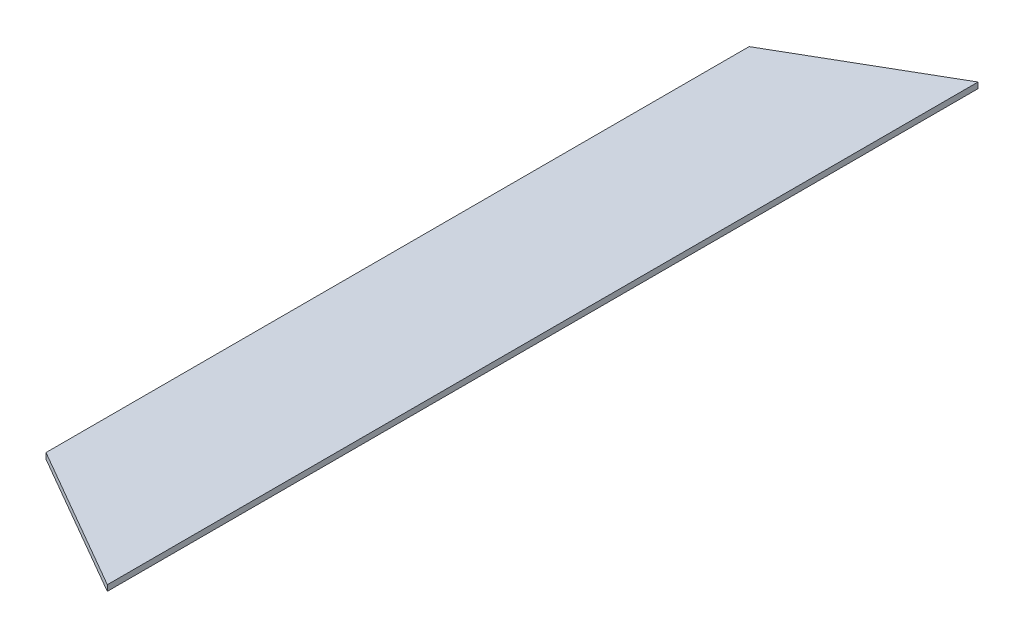
ISO-10303-21;
HEADER;
FILE_DESCRIPTION(('STEP AP214'),'2;1');
FILE_NAME('part.step','',(''),(''),'','','');
FILE_SCHEMA(('AUTOMOTIVE_DESIGN { 1 0 10303 214 1 1 1 1 }'));
ENDSEC;
DATA;
#1=APPLICATION_CONTEXT('core data for automotive mechanical design processes');
#2=APPLICATION_PROTOCOL_DEFINITION('international standard','automotive_design',2000,#1);
#3=PRODUCT_CONTEXT('',#1,'mechanical');
#4=PRODUCT('Part','Part','',(#3));
#5=PRODUCT_RELATED_PRODUCT_CATEGORY('part','',(#4));
#6=PRODUCT_DEFINITION_FORMATION('','',#4);
#7=PRODUCT_DEFINITION_CONTEXT('part definition',#1,'design');
#8=PRODUCT_DEFINITION('design','',#6,#7);
#9=PRODUCT_DEFINITION_SHAPE('','',#8);
#10=(LENGTH_UNIT() NAMED_UNIT(*) SI_UNIT(.MILLI.,.METRE.));
#11=(NAMED_UNIT(*) PLANE_ANGLE_UNIT() SI_UNIT($,.RADIAN.));
#12=(NAMED_UNIT(*) SI_UNIT($,.STERADIAN.) SOLID_ANGLE_UNIT());
#13=UNCERTAINTY_MEASURE_WITH_UNIT(LENGTH_MEASURE(1.E-05),#10,'distance_accuracy_value','');
#14=(GEOMETRIC_REPRESENTATION_CONTEXT(3) GLOBAL_UNCERTAINTY_ASSIGNED_CONTEXT((#13)) GLOBAL_UNIT_ASSIGNED_CONTEXT((#10,
#11,#12)) REPRESENTATION_CONTEXT('',''));
#15=CARTESIAN_POINT('',(0.,0.,0.));
#16=DIRECTION('',(0.,0.,1.));
#17=DIRECTION('',(1.,0.,0.));
#18=AXIS2_PLACEMENT_3D('',#15,#16,#17);
#19=CARTESIAN_POINT('',(-5.,10.,0.));
#20=DIRECTION('',(-1.,0.,0.));
#21=DIRECTION('',(0.,0.,1.));
#22=AXIS2_PLACEMENT_3D('',#19,#20,#21);
#23=PLANE('',#22);
#24=DIRECTION('',(0.,1.,0.));
#25=VECTOR('',#24,1.);
#26=CARTESIAN_POINT('',(-5.,10.,-92.1132486540519));
#27=LINE('',#26,#25);
#28=CARTESIAN_POINT('',(-5.,10.,-92.1132486540519));
#29=VERTEX_POINT('',#28);
#30=CARTESIAN_POINT('',(-5.,10.2,-92.1132486540519));
#31=VERTEX_POINT('',#30);
#32=EDGE_CURVE('E11',#29,#31,#27,.T.);
#33=ORIENTED_EDGE('',*,*,#32,.F.);
#34=DIRECTION('',(0.,0.,1.));
#35=VECTOR('',#34,1.);
#36=CARTESIAN_POINT('',(-5.,10.,0.));
#37=LINE('',#36,#35);
#38=CARTESIAN_POINT('',(-5.,10.,-67.8867513459481));
#39=VERTEX_POINT('',#38);
#40=EDGE_CURVE('E88',#29,#39,#37,.T.);
#41=ORIENTED_EDGE('',*,*,#40,.T.);
#42=DIRECTION('',(0.,1.,0.));
#43=VECTOR('',#42,1.);
#44=CARTESIAN_POINT('',(-5.,10.,-67.8867513459481));
#45=LINE('',#44,#43);
#46=CARTESIAN_POINT('',(-5.,10.2,-67.8867513459481));
#47=VERTEX_POINT('',#46);
#48=EDGE_CURVE('E43',#39,#47,#45,.T.);
#49=ORIENTED_EDGE('',*,*,#48,.T.);
#50=DIRECTION('',(0.,0.,1.));
#51=VECTOR('',#50,1.);
#52=CARTESIAN_POINT('',(-5.,10.2,0.));
#53=LINE('',#52,#51);
#54=EDGE_CURVE('E101',#31,#47,#53,.T.);
#55=ORIENTED_EDGE('',*,*,#54,.F.);
#56=EDGE_LOOP('',(#33,#41,#49,#55));
#57=FACE_BOUND('',#56,.T.);
#58=ADVANCED_FACE('F33',(#57),#23,.T.);
#59=CARTESIAN_POINT('',(-5.,10.,-67.8867513459481));
#60=DIRECTION('',(-0.499999999999997,0.,0.86602540378444));
#61=DIRECTION('',(0.86602540378444,0.,0.499999999999997));
#62=AXIS2_PLACEMENT_3D('',#59,#60,#61);
#63=PLANE('',#62);
#64=ORIENTED_EDGE('',*,*,#48,.F.);
#65=DIRECTION('',(0.86602540378444,0.,0.499999999999997));
#66=VECTOR('',#65,1.);
#67=CARTESIAN_POINT('',(-5.,10.,-67.8867513459481));
#68=LINE('',#67,#66);
#69=CARTESIAN_POINT('',(0.,10.,-65.));
#70=VERTEX_POINT('',#69);
#71=EDGE_CURVE('E95',#39,#70,#68,.T.);
#72=ORIENTED_EDGE('',*,*,#71,.T.);
#73=DIRECTION('',(0.,1.,0.));
#74=VECTOR('',#73,1.);
#75=CARTESIAN_POINT('',(0.,10.,-65.));
#76=LINE('',#75,#74);
#77=CARTESIAN_POINT('',(0.,10.2,-65.));
#78=VERTEX_POINT('',#77);
#79=EDGE_CURVE('E51',#70,#78,#76,.T.);
#80=ORIENTED_EDGE('',*,*,#79,.T.);
#81=DIRECTION('',(0.86602540378444,0.,0.499999999999997));
#82=VECTOR('',#81,1.);
#83=CARTESIAN_POINT('',(-5.,10.2,-67.8867513459481));
#84=LINE('',#83,#82);
#85=EDGE_CURVE('E82',#47,#78,#84,.T.);
#86=ORIENTED_EDGE('',*,*,#85,.F.);
#87=EDGE_LOOP('',(#64,#72,#80,#86));
#88=FACE_BOUND('',#87,.T.);
#89=ADVANCED_FACE('F105',(#88),#63,.T.);
#90=CARTESIAN_POINT('',(0.,10.,0.));
#91=DIRECTION('',(-1.,0.,0.));
#92=DIRECTION('',(0.,0.,1.));
#93=AXIS2_PLACEMENT_3D('',#90,#91,#92);
#94=PLANE('',#93);
#95=ORIENTED_EDGE('',*,*,#79,.F.);
#96=DIRECTION('',(0.,0.,1.));
#97=VECTOR('',#96,1.);
#98=CARTESIAN_POINT('',(0.,10.,0.));
#99=LINE('',#98,#97);
#100=CARTESIAN_POINT('',(0.,10.,-95.));
#101=VERTEX_POINT('',#100);
#102=EDGE_CURVE('E87',#101,#70,#99,.T.);
#103=ORIENTED_EDGE('',*,*,#102,.F.);
#104=DIRECTION('',(0.,1.,0.));
#105=VECTOR('',#104,1.);
#106=CARTESIAN_POINT('',(0.,10.,-95.));
#107=LINE('',#106,#105);
#108=CARTESIAN_POINT('',(0.,10.2,-95.));
#109=VERTEX_POINT('',#108);
#110=EDGE_CURVE('E37',#101,#109,#107,.T.);
#111=ORIENTED_EDGE('',*,*,#110,.T.);
#112=DIRECTION('',(0.,0.,1.));
#113=VECTOR('',#112,1.);
#114=CARTESIAN_POINT('',(0.,10.2,0.));
#115=LINE('',#114,#113);
#116=EDGE_CURVE('E97',#109,#78,#115,.T.);
#117=ORIENTED_EDGE('',*,*,#116,.T.);
#118=EDGE_LOOP('',(#95,#103,#111,#117));
#119=FACE_BOUND('',#118,.T.);
#120=ADVANCED_FACE('F90',(#119),#94,.F.);
#121=CARTESIAN_POINT('',(0.,10.,-95.));
#122=DIRECTION('',(-0.499999999999997,0.,-0.86602540378444));
#123=DIRECTION('',(-0.86602540378444,0.,0.499999999999997));
#124=AXIS2_PLACEMENT_3D('',#121,#122,#123);
#125=PLANE('',#124);
#126=DIRECTION('',(-0.86602540378444,0.,0.499999999999997));
#127=VECTOR('',#126,1.);
#128=CARTESIAN_POINT('',(0.,10.,-95.));
#129=LINE('',#128,#127);
#130=EDGE_CURVE('E76',#101,#29,#129,.T.);
#131=ORIENTED_EDGE('',*,*,#130,.T.);
#132=ORIENTED_EDGE('',*,*,#32,.T.);
#133=DIRECTION('',(-0.86602540378444,0.,0.499999999999997));
#134=VECTOR('',#133,1.);
#135=CARTESIAN_POINT('',(0.,10.2,-95.));
#136=LINE('',#135,#134);
#137=EDGE_CURVE('E78',#109,#31,#136,.T.);
#138=ORIENTED_EDGE('',*,*,#137,.F.);
#139=ORIENTED_EDGE('',*,*,#110,.F.);
#140=EDGE_LOOP('',(#131,#132,#138,#139));
#141=FACE_BOUND('',#140,.T.);
#142=ADVANCED_FACE('F35',(#141),#125,.T.);
#143=CARTESIAN_POINT('',(0.,10.2,0.));
#144=DIRECTION('',(0.,1.,0.));
#145=DIRECTION('',(0.,0.,1.));
#146=AXIS2_PLACEMENT_3D('',#143,#144,#145);
#147=PLANE('',#146);
#148=ORIENTED_EDGE('',*,*,#116,.F.);
#149=ORIENTED_EDGE('',*,*,#137,.T.);
#150=ORIENTED_EDGE('',*,*,#54,.T.);
#151=ORIENTED_EDGE('',*,*,#85,.T.);
#152=EDGE_LOOP('',(#148,#149,#150,#151));
#153=FACE_BOUND('',#152,.T.);
#154=ADVANCED_FACE('F104',(#153),#147,.T.);
#155=CARTESIAN_POINT('',(0.,10.,0.));
#156=DIRECTION('',(0.,1.,0.));
#157=DIRECTION('',(0.,0.,1.));
#158=AXIS2_PLACEMENT_3D('',#155,#156,#157);
#159=PLANE('',#158);
#160=ORIENTED_EDGE('',*,*,#102,.T.);
#161=ORIENTED_EDGE('',*,*,#71,.F.);
#162=ORIENTED_EDGE('',*,*,#40,.F.);
#163=ORIENTED_EDGE('',*,*,#130,.F.);
#164=EDGE_LOOP('',(#160,#161,#162,#163));
#165=FACE_BOUND('',#164,.T.);
#166=ADVANCED_FACE('F85',(#165),#159,.F.);
#167=CLOSED_SHELL('',(#58,#89,#120,#142,#154,#166));
#168=MANIFOLD_SOLID_BREP('B2',#167);
#169=ADVANCED_BREP_SHAPE_REPRESENTATION('',(#18,#168),#14);
#170=SHAPE_DEFINITION_REPRESENTATION(#9,#169);
ENDSEC;
END-ISO-10303-21;
